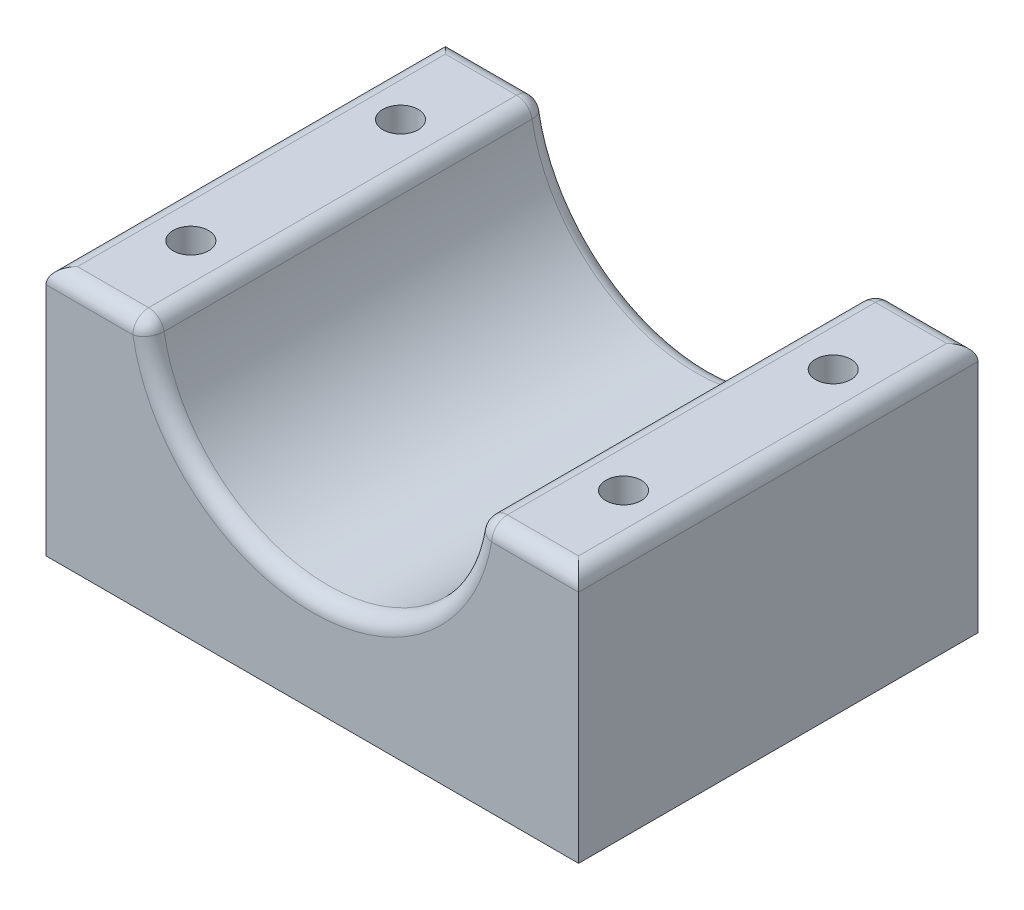
ISO-10303-21;
HEADER;
FILE_DESCRIPTION(('STEP AP214'),'2;1');
FILE_NAME('part.step','',(''),(''),'','','');
FILE_SCHEMA(('AUTOMOTIVE_DESIGN { 1 0 10303 214 1 1 1 1 }'));
ENDSEC;
DATA;
#1=APPLICATION_CONTEXT('core data for automotive mechanical design processes');
#2=APPLICATION_PROTOCOL_DEFINITION('international standard','automotive_design',2000,#1);
#3=PRODUCT_CONTEXT('',#1,'mechanical');
#4=PRODUCT('Part','Part','',(#3));
#5=PRODUCT_RELATED_PRODUCT_CATEGORY('part','',(#4));
#6=PRODUCT_DEFINITION_FORMATION('','',#4);
#7=PRODUCT_DEFINITION_CONTEXT('part definition',#1,'design');
#8=PRODUCT_DEFINITION('design','',#6,#7);
#9=PRODUCT_DEFINITION_SHAPE('','',#8);
#10=(LENGTH_UNIT() NAMED_UNIT(*) SI_UNIT(.MILLI.,.METRE.));
#11=(NAMED_UNIT(*) PLANE_ANGLE_UNIT() SI_UNIT($,.RADIAN.));
#12=(NAMED_UNIT(*) SI_UNIT($,.STERADIAN.) SOLID_ANGLE_UNIT());
#13=UNCERTAINTY_MEASURE_WITH_UNIT(LENGTH_MEASURE(1.E-05),#10,'distance_accuracy_value','');
#14=(GEOMETRIC_REPRESENTATION_CONTEXT(3) GLOBAL_UNCERTAINTY_ASSIGNED_CONTEXT((#13)) GLOBAL_UNIT_ASSIGNED_CONTEXT((#10,
#11,#12)) REPRESENTATION_CONTEXT('',''));
#15=CARTESIAN_POINT('',(0.,0.,0.));
#16=DIRECTION('',(0.,0.,1.));
#17=DIRECTION('',(1.,0.,0.));
#18=AXIS2_PLACEMENT_3D('',#15,#16,#17);
#19=CARTESIAN_POINT('',(-50.8,23.9,76.2));
#20=DIRECTION('',(0.,-1.,0.));
#21=DIRECTION('',(0.,0.,-1.));
#22=AXIS2_PLACEMENT_3D('',#19,#20,#21);
#23=PLANE('',#22);
#24=CARTESIAN_POINT('',(41.28,23.9,18.1));
#25=DIRECTION('',(0.,-1.,0.));
#26=DIRECTION('',(0.,0.,-1.));
#27=AXIS2_PLACEMENT_3D('',#24,#25,#26);
#28=CIRCLE('',#27,3.37819999999999);
#29=CARTESIAN_POINT('',(41.28,23.9,14.7218));
#30=VERTEX_POINT('',#29);
#31=EDGE_CURVE('E394',#30,#30,#28,.T.);
#32=ORIENTED_EDGE('',*,*,#31,.T.);
#33=EDGE_LOOP('',(#32));
#34=FACE_BOUND('',#33,.T.);
#35=CARTESIAN_POINT('',(41.28,23.9,58.1));
#36=DIRECTION('',(0.,-1.,0.));
#37=DIRECTION('',(0.,0.,-1.));
#38=AXIS2_PLACEMENT_3D('',#35,#36,#37);
#39=CIRCLE('',#38,3.37819999999999);
#40=CARTESIAN_POINT('',(41.28,23.9,54.7218));
#41=VERTEX_POINT('',#40);
#42=EDGE_CURVE('E374',#41,#41,#39,.T.);
#43=ORIENTED_EDGE('',*,*,#42,.T.);
#44=EDGE_LOOP('',(#43));
#45=FACE_BOUND('',#44,.T.);
#46=DIRECTION('',(-1.,0.,0.));
#47=VECTOR('',#46,1.);
#48=CARTESIAN_POINT('',(-50.8,23.9,73.2));
#49=LINE('',#48,#47);
#50=CARTESIAN_POINT('',(34.2280951850961,23.9,73.2));
#51=VERTEX_POINT('',#50);
#52=CARTESIAN_POINT('',(47.8,23.9,73.2));
#53=VERTEX_POINT('',#52);
#54=EDGE_CURVE('E175',#51,#53,#49,.F.);
#55=ORIENTED_EDGE('',*,*,#54,.T.);
#56=DIRECTION('',(0.,0.,-1.));
#57=VECTOR('',#56,1.);
#58=CARTESIAN_POINT('',(47.8,23.9,76.2));
#59=LINE('',#58,#57);
#60=CARTESIAN_POINT('',(47.8,23.9,3.));
#61=VERTEX_POINT('',#60);
#62=EDGE_CURVE('E178',#53,#61,#59,.T.);
#63=ORIENTED_EDGE('',*,*,#62,.T.);
#64=DIRECTION('',(-1.,0.,0.));
#65=VECTOR('',#64,1.);
#66=CARTESIAN_POINT('',(31.6079499493403,23.9,3.));
#67=LINE('',#66,#65);
#68=CARTESIAN_POINT('',(34.2280951850961,23.9,3.));
#69=VERTEX_POINT('',#68);
#70=EDGE_CURVE('E172',#61,#69,#67,.T.);
#71=ORIENTED_EDGE('',*,*,#70,.T.);
#72=DIRECTION('',(0.,0.,1.));
#73=VECTOR('',#72,1.);
#74=CARTESIAN_POINT('',(34.2280951850961,23.9,76.2));
#75=LINE('',#74,#73);
#76=EDGE_CURVE('E149',#69,#51,#75,.T.);
#77=ORIENTED_EDGE('',*,*,#76,.T.);
#78=EDGE_LOOP('',(#55,#63,#71,#77));
#79=FACE_BOUND('',#78,.T.);
#80=ADVANCED_FACE('F39',(#34,#45,#79),#23,.F.);
#81=CARTESIAN_POINT('',(50.8,-23.9,76.2));
#82=DIRECTION('',(-1.,0.,0.));
#83=DIRECTION('',(0.,0.,1.));
#84=AXIS2_PLACEMENT_3D('',#81,#82,#83);
#85=PLANE('',#84);
#86=DIRECTION('',(0.,1.,0.));
#87=VECTOR('',#86,1.);
#88=CARTESIAN_POINT('',(50.8,-23.9,0.));
#89=LINE('',#88,#87);
#90=CARTESIAN_POINT('',(50.8,-23.9,0.));
#91=VERTEX_POINT('',#90);
#92=CARTESIAN_POINT('',(50.8,20.9,0.));
#93=VERTEX_POINT('',#92);
#94=EDGE_CURVE('E161',#91,#93,#89,.T.);
#95=ORIENTED_EDGE('',*,*,#94,.T.);
#96=DIRECTION('',(0.,0.,-1.));
#97=VECTOR('',#96,1.);
#98=CARTESIAN_POINT('',(50.8,20.9,76.2));
#99=LINE('',#98,#97);
#100=CARTESIAN_POINT('',(50.8,20.9,76.2));
#101=VERTEX_POINT('',#100);
#102=EDGE_CURVE('E182',#93,#101,#99,.F.);
#103=ORIENTED_EDGE('',*,*,#102,.T.);
#104=DIRECTION('',(0.,1.,0.));
#105=VECTOR('',#104,1.);
#106=CARTESIAN_POINT('',(50.8,-23.9,76.2));
#107=LINE('',#106,#105);
#108=CARTESIAN_POINT('',(50.8,-23.9,76.2));
#109=VERTEX_POINT('',#108);
#110=EDGE_CURVE('E139',#109,#101,#107,.T.);
#111=ORIENTED_EDGE('',*,*,#110,.F.);
#112=DIRECTION('',(0.,0.,-1.));
#113=VECTOR('',#112,1.);
#114=CARTESIAN_POINT('',(50.8,-23.9,76.2));
#115=LINE('',#114,#113);
#116=EDGE_CURVE('E150',#109,#91,#115,.T.);
#117=ORIENTED_EDGE('',*,*,#116,.T.);
#118=EDGE_LOOP('',(#95,#103,#111,#117));
#119=FACE_BOUND('',#118,.T.);
#120=ADVANCED_FACE('F331',(#119),#85,.F.);
#121=CARTESIAN_POINT('',(-41.27,23.9,18.1));
#122=DIRECTION('',(0.,-1.,0.));
#123=DIRECTION('',(0.,0.,-1.));
#124=AXIS2_PLACEMENT_3D('',#121,#122,#123);
#125=CIRCLE('',#124,3.37819999999999);
#126=CARTESIAN_POINT('',(-41.27,23.9,14.7218));
#127=VERTEX_POINT('',#126);
#128=EDGE_CURVE('E354',#127,#127,#125,.T.);
#129=ORIENTED_EDGE('',*,*,#128,.T.);
#130=EDGE_LOOP('',(#129));
#131=FACE_BOUND('',#130,.T.);
#132=CARTESIAN_POINT('',(-41.27,23.9,58.1));
#133=DIRECTION('',(0.,-1.,0.));
#134=DIRECTION('',(0.,0.,-1.));
#135=AXIS2_PLACEMENT_3D('',#132,#133,#134);
#136=CIRCLE('',#135,3.37819999999999);
#137=CARTESIAN_POINT('',(-41.27,23.9,54.7218));
#138=VERTEX_POINT('',#137);
#139=EDGE_CURVE('E230',#138,#138,#136,.T.);
#140=ORIENTED_EDGE('',*,*,#139,.T.);
#141=EDGE_LOOP('',(#140));
#142=FACE_BOUND('',#141,.T.);
#143=DIRECTION('',(-1.,0.,0.));
#144=VECTOR('',#143,1.);
#145=CARTESIAN_POINT('',(-50.8,23.9,3.));
#146=LINE('',#145,#144);
#147=CARTESIAN_POINT('',(-34.2280951850961,23.9,3.));
#148=VERTEX_POINT('',#147);
#149=CARTESIAN_POINT('',(-47.8,23.9,3.));
#150=VERTEX_POINT('',#149);
#151=EDGE_CURVE('E49',#148,#150,#146,.T.);
#152=ORIENTED_EDGE('',*,*,#151,.T.);
#153=DIRECTION('',(0.,0.,-1.));
#154=VECTOR('',#153,1.);
#155=CARTESIAN_POINT('',(-47.8,23.9,76.2));
#156=LINE('',#155,#154);
#157=CARTESIAN_POINT('',(-47.8,23.9,73.2));
#158=VERTEX_POINT('',#157);
#159=EDGE_CURVE('E11',#150,#158,#156,.F.);
#160=ORIENTED_EDGE('',*,*,#159,.T.);
#161=DIRECTION('',(-1.,0.,0.));
#162=VECTOR('',#161,1.);
#163=CARTESIAN_POINT('',(-50.8,23.9,73.2));
#164=LINE('',#163,#162);
#165=CARTESIAN_POINT('',(-34.2280951850961,23.9,73.2));
#166=VERTEX_POINT('',#165);
#167=EDGE_CURVE('E219',#158,#166,#164,.F.);
#168=ORIENTED_EDGE('',*,*,#167,.T.);
#169=DIRECTION('',(0.,0.,1.));
#170=VECTOR('',#169,1.);
#171=CARTESIAN_POINT('',(-34.2280951850961,23.9,76.2));
#172=LINE('',#171,#170);
#173=EDGE_CURVE('E60',#166,#148,#172,.F.);
#174=ORIENTED_EDGE('',*,*,#173,.T.);
#175=EDGE_LOOP('',(#152,#160,#168,#174));
#176=FACE_BOUND('',#175,.T.);
#177=ADVANCED_FACE('F292',(#131,#142,#176),#23,.F.);
#178=CARTESIAN_POINT('',(-50.8,-23.9,76.2));
#179=DIRECTION('',(1.,0.,0.));
#180=DIRECTION('',(0.,0.,-1.));
#181=AXIS2_PLACEMENT_3D('',#178,#179,#180);
#182=PLANE('',#181);
#183=DIRECTION('',(0.,-1.,0.));
#184=VECTOR('',#183,1.);
#185=CARTESIAN_POINT('',(-50.8,-23.9,76.2));
#186=LINE('',#185,#184);
#187=CARTESIAN_POINT('',(-50.8,20.9,76.2));
#188=VERTEX_POINT('',#187);
#189=CARTESIAN_POINT('',(-50.8,-23.9,76.2));
#190=VERTEX_POINT('',#189);
#191=EDGE_CURVE('E127',#188,#190,#186,.T.);
#192=ORIENTED_EDGE('',*,*,#191,.F.);
#193=DIRECTION('',(0.,0.,-1.));
#194=VECTOR('',#193,1.);
#195=CARTESIAN_POINT('',(-50.8,20.9,76.2));
#196=LINE('',#195,#194);
#197=CARTESIAN_POINT('',(-50.8,20.9,0.));
#198=VERTEX_POINT('',#197);
#199=EDGE_CURVE('E216',#188,#198,#196,.T.);
#200=ORIENTED_EDGE('',*,*,#199,.T.);
#201=DIRECTION('',(0.,-1.,0.));
#202=VECTOR('',#201,1.);
#203=CARTESIAN_POINT('',(-50.8,-23.9,0.));
#204=LINE('',#203,#202);
#205=CARTESIAN_POINT('',(-50.8,-23.9,0.));
#206=VERTEX_POINT('',#205);
#207=EDGE_CURVE('E145',#198,#206,#204,.T.);
#208=ORIENTED_EDGE('',*,*,#207,.T.);
#209=DIRECTION('',(0.,0.,-1.));
#210=VECTOR('',#209,1.);
#211=CARTESIAN_POINT('',(-50.8,-23.9,76.2));
#212=LINE('',#211,#210);
#213=EDGE_CURVE('E142',#190,#206,#212,.T.);
#214=ORIENTED_EDGE('',*,*,#213,.F.);
#215=EDGE_LOOP('',(#192,#200,#208,#214));
#216=FACE_BOUND('',#215,.T.);
#217=ADVANCED_FACE('F143',(#216),#182,.F.);
#218=CARTESIAN_POINT('',(-50.8,-23.9,76.2));
#219=DIRECTION('',(0.,1.,0.));
#220=DIRECTION('',(0.,0.,1.));
#221=AXIS2_PLACEMENT_3D('',#218,#219,#220);
#222=PLANE('',#221);
#223=CARTESIAN_POINT('',(41.28,-23.9,18.1));
#224=DIRECTION('',(0.,-1.,0.));
#225=DIRECTION('',(0.,0.,-1.));
#226=AXIS2_PLACEMENT_3D('',#223,#224,#225);
#227=CIRCLE('',#226,7.77875);
#228=CARTESIAN_POINT('',(41.28,-23.9,10.32125));
#229=VERTEX_POINT('',#228);
#230=EDGE_CURVE('E410',#229,#229,#227,.T.);
#231=ORIENTED_EDGE('',*,*,#230,.F.);
#232=EDGE_LOOP('',(#231));
#233=FACE_BOUND('',#232,.T.);
#234=CARTESIAN_POINT('',(41.28,-23.9,58.1));
#235=DIRECTION('',(0.,-1.,0.));
#236=DIRECTION('',(0.,0.,-1.));
#237=AXIS2_PLACEMENT_3D('',#234,#235,#236);
#238=CIRCLE('',#237,7.77875);
#239=CARTESIAN_POINT('',(41.28,-23.9,50.32125));
#240=VERTEX_POINT('',#239);
#241=EDGE_CURVE('E390',#240,#240,#238,.T.);
#242=ORIENTED_EDGE('',*,*,#241,.F.);
#243=EDGE_LOOP('',(#242));
#244=FACE_BOUND('',#243,.T.);
#245=CARTESIAN_POINT('',(-41.27,-23.9,18.1));
#246=DIRECTION('',(0.,-1.,0.));
#247=DIRECTION('',(0.,0.,-1.));
#248=AXIS2_PLACEMENT_3D('',#245,#246,#247);
#249=CIRCLE('',#248,7.77875);
#250=CARTESIAN_POINT('',(-41.27,-23.9,10.32125));
#251=VERTEX_POINT('',#250);
#252=EDGE_CURVE('E370',#251,#251,#249,.T.);
#253=ORIENTED_EDGE('',*,*,#252,.F.);
#254=EDGE_LOOP('',(#253));
#255=FACE_BOUND('',#254,.T.);
#256=CARTESIAN_POINT('',(-41.27,-23.9,58.1));
#257=DIRECTION('',(0.,-1.,0.));
#258=DIRECTION('',(0.,0.,-1.));
#259=AXIS2_PLACEMENT_3D('',#256,#257,#258);
#260=CIRCLE('',#259,7.77875);
#261=CARTESIAN_POINT('',(-41.27,-23.9,50.32125));
#262=VERTEX_POINT('',#261);
#263=EDGE_CURVE('E350',#262,#262,#260,.T.);
#264=ORIENTED_EDGE('',*,*,#263,.F.);
#265=EDGE_LOOP('',(#264));
#266=FACE_BOUND('',#265,.T.);
#267=DIRECTION('',(1.,0.,0.));
#268=VECTOR('',#267,1.);
#269=CARTESIAN_POINT('',(-50.8,-23.9,0.));
#270=LINE('',#269,#268);
#271=EDGE_CURVE('E167',#206,#91,#270,.T.);
#272=ORIENTED_EDGE('',*,*,#271,.T.);
#273=ORIENTED_EDGE('',*,*,#116,.F.);
#274=DIRECTION('',(1.,0.,0.));
#275=VECTOR('',#274,1.);
#276=CARTESIAN_POINT('',(-50.8,-23.9,76.2));
#277=LINE('',#276,#275);
#278=EDGE_CURVE('E132',#190,#109,#277,.T.);
#279=ORIENTED_EDGE('',*,*,#278,.F.);
#280=ORIENTED_EDGE('',*,*,#213,.T.);
#281=EDGE_LOOP('',(#272,#273,#279,#280));
#282=FACE_BOUND('',#281,.T.);
#283=ADVANCED_FACE('F152',(#233,#244,#255,#266,#282),#222,.F.);
#284=CARTESIAN_POINT('',(0.,0.,76.2));
#285=DIRECTION('',(0.,0.,-1.));
#286=DIRECTION('',(-1.,0.,0.));
#287=AXIS2_PLACEMENT_3D('',#284,#285,#286);
#288=PLANE('',#287);
#289=ORIENTED_EDGE('',*,*,#110,.T.);
#290=DIRECTION('',(-1.,0.,0.));
#291=VECTOR('',#290,1.);
#292=CARTESIAN_POINT('',(0.,20.9,76.2));
#293=LINE('',#292,#291);
#294=CARTESIAN_POINT('',(34.2280951850961,20.9,76.2));
#295=VERTEX_POINT('',#294);
#296=EDGE_CURVE('E191',#101,#295,#293,.T.);
#297=ORIENTED_EDGE('',*,*,#296,.T.);
#298=CARTESIAN_POINT('',(0.,26.9,76.2));
#299=DIRECTION('',(0.,0.,-1.));
#300=DIRECTION('',(-1.,0.,0.));
#301=AXIS2_PLACEMENT_3D('',#298,#299,#300);
#302=CIRCLE('',#301,34.75);
#303=CARTESIAN_POINT('',(-34.2280951850961,20.9,76.2));
#304=VERTEX_POINT('',#303);
#305=EDGE_CURVE('E188',#295,#304,#302,.T.);
#306=ORIENTED_EDGE('',*,*,#305,.T.);
#307=DIRECTION('',(-1.,0.,0.));
#308=VECTOR('',#307,1.);
#309=CARTESIAN_POINT('',(0.,20.9,76.2));
#310=LINE('',#309,#308);
#311=EDGE_CURVE('E135',#304,#188,#310,.T.);
#312=ORIENTED_EDGE('',*,*,#311,.T.);
#313=ORIENTED_EDGE('',*,*,#191,.T.);
#314=ORIENTED_EDGE('',*,*,#278,.T.);
#315=EDGE_LOOP('',(#289,#297,#306,#312,#313,#314));
#316=FACE_BOUND('',#315,.T.);
#317=ADVANCED_FACE('F130',(#316),#288,.F.);
#318=CARTESIAN_POINT('',(0.,0.,0.));
#319=DIRECTION('',(0.,0.,-1.));
#320=DIRECTION('',(-1.,0.,0.));
#321=AXIS2_PLACEMENT_3D('',#318,#319,#320);
#322=PLANE('',#321);
#323=CARTESIAN_POINT('',(0.,26.9,0.));
#324=DIRECTION('',(0.,0.,-1.));
#325=DIRECTION('',(-1.,0.,0.));
#326=AXIS2_PLACEMENT_3D('',#323,#324,#325);
#327=CIRCLE('',#326,34.75);
#328=CARTESIAN_POINT('',(-34.2280951850961,20.9,0.));
#329=VERTEX_POINT('',#328);
#330=CARTESIAN_POINT('',(34.2280951850961,20.9,0.));
#331=VERTEX_POINT('',#330);
#332=EDGE_CURVE('E197',#329,#331,#327,.F.);
#333=ORIENTED_EDGE('',*,*,#332,.T.);
#334=DIRECTION('',(-1.,0.,0.));
#335=VECTOR('',#334,1.);
#336=CARTESIAN_POINT('',(50.8,20.9,0.));
#337=LINE('',#336,#335);
#338=EDGE_CURVE('E200',#331,#93,#337,.F.);
#339=ORIENTED_EDGE('',*,*,#338,.T.);
#340=ORIENTED_EDGE('',*,*,#94,.F.);
#341=ORIENTED_EDGE('',*,*,#271,.F.);
#342=ORIENTED_EDGE('',*,*,#207,.F.);
#343=DIRECTION('',(-1.,0.,0.));
#344=VECTOR('',#343,1.);
#345=CARTESIAN_POINT('',(-31.6079499493403,20.9,0.));
#346=LINE('',#345,#344);
#347=EDGE_CURVE('E194',#198,#329,#346,.F.);
#348=ORIENTED_EDGE('',*,*,#347,.T.);
#349=EDGE_LOOP('',(#333,#339,#340,#341,#342,#348));
#350=FACE_BOUND('',#349,.T.);
#351=ADVANCED_FACE('F328',(#350),#322,.T.);
#352=CARTESIAN_POINT('',(0.,26.9,0.));
#353=DIRECTION('',(0.,0.,1.));
#354=DIRECTION('',(1.,0.,0.));
#355=AXIS2_PLACEMENT_3D('',#352,#353,#354);
#356=CYLINDRICAL_SURFACE('',#355,31.75);
#357=CARTESIAN_POINT('',(0.,26.9,73.2));
#358=DIRECTION('',(0.,0.,-1.));
#359=DIRECTION('',(-1.,0.,0.));
#360=AXIS2_PLACEMENT_3D('',#357,#358,#359);
#361=CIRCLE('',#360,31.75);
#362=CARTESIAN_POINT('',(-31.2731517158792,21.4179856115108,73.2));
#363=VERTEX_POINT('',#362);
#364=CARTESIAN_POINT('',(31.2731517158792,21.4179856115108,73.2));
#365=VERTEX_POINT('',#364);
#366=EDGE_CURVE('E209',#363,#365,#361,.F.);
#367=ORIENTED_EDGE('',*,*,#366,.T.);
#368=DIRECTION('',(0.,0.,1.));
#369=VECTOR('',#368,1.);
#370=CARTESIAN_POINT('',(31.2731517158792,21.4179856115108,0.));
#371=LINE('',#370,#369);
#372=CARTESIAN_POINT('',(31.2731517158792,21.4179856115108,3.));
#373=VERTEX_POINT('',#372);
#374=EDGE_CURVE('E212',#365,#373,#371,.F.);
#375=ORIENTED_EDGE('',*,*,#374,.T.);
#376=CARTESIAN_POINT('',(0.,26.9,3.));
#377=DIRECTION('',(0.,0.,-1.));
#378=DIRECTION('',(-1.,0.,0.));
#379=AXIS2_PLACEMENT_3D('',#376,#377,#378);
#380=CIRCLE('',#379,31.75);
#381=CARTESIAN_POINT('',(-31.2731517158792,21.4179856115108,3.));
#382=VERTEX_POINT('',#381);
#383=EDGE_CURVE('E206',#373,#382,#380,.T.);
#384=ORIENTED_EDGE('',*,*,#383,.T.);
#385=DIRECTION('',(0.,0.,1.));
#386=VECTOR('',#385,1.);
#387=CARTESIAN_POINT('',(-31.2731517158792,21.4179856115108,0.));
#388=LINE('',#387,#386);
#389=EDGE_CURVE('E203',#382,#363,#388,.T.);
#390=ORIENTED_EDGE('',*,*,#389,.T.);
#391=EDGE_LOOP('',(#367,#375,#384,#390));
#392=FACE_BOUND('',#391,.T.);
#393=ADVANCED_FACE('F308',(#392),#356,.F.);
#394=CARTESIAN_POINT('',(-47.8,20.9,76.2));
#395=DIRECTION('',(0.,0.,-1.));
#396=DIRECTION('',(-1.,0.,0.));
#397=AXIS2_PLACEMENT_3D('',#394,#395,#396);
#398=CYLINDRICAL_SURFACE('',#397,3.);
#399=CARTESIAN_POINT('',(-47.8,20.9,3.));
#400=DIRECTION('',(0.707106781186547,0.,-0.707106781186547));
#401=DIRECTION('',(0.707106781186547,0.,0.707106781186547));
#402=AXIS2_PLACEMENT_3D('',#399,#400,#401);
#403=ELLIPSE('',#402,4.24264068711928,3.);
#404=EDGE_CURVE('E279',#198,#150,#403,.T.);
#405=ORIENTED_EDGE('',*,*,#404,.F.);
#406=ORIENTED_EDGE('',*,*,#199,.F.);
#407=CARTESIAN_POINT('',(-47.8,20.9,73.2));
#408=DIRECTION('',(-0.707106781186547,0.,-0.707106781186547));
#409=DIRECTION('',(-0.707106781186547,0.,0.707106781186547));
#410=AXIS2_PLACEMENT_3D('',#407,#408,#409);
#411=ELLIPSE('',#410,4.24264068711928,3.);
#412=EDGE_CURVE('E43',#158,#188,#411,.F.);
#413=ORIENTED_EDGE('',*,*,#412,.F.);
#414=ORIENTED_EDGE('',*,*,#159,.F.);
#415=EDGE_LOOP('',(#405,#406,#413,#414));
#416=FACE_BOUND('',#415,.T.);
#417=ADVANCED_FACE('F41',(#416),#398,.T.);
#418=CARTESIAN_POINT('',(0.,20.9,73.2));
#419=DIRECTION('',(-1.,0.,0.));
#420=DIRECTION('',(0.,0.,1.));
#421=AXIS2_PLACEMENT_3D('',#418,#419,#420);
#422=CYLINDRICAL_SURFACE('',#421,3.);
#423=ORIENTED_EDGE('',*,*,#412,.T.);
#424=ORIENTED_EDGE('',*,*,#311,.F.);
#425=CARTESIAN_POINT('',(-34.2280951850961,20.9,73.2));
#426=DIRECTION('',(1.,0.,0.));
#427=DIRECTION('',(0.,0.,-1.));
#428=AXIS2_PLACEMENT_3D('',#425,#426,#427);
#429=CIRCLE('',#428,3.);
#430=EDGE_CURVE('E276',#166,#304,#429,.T.);
#431=ORIENTED_EDGE('',*,*,#430,.F.);
#432=ORIENTED_EDGE('',*,*,#167,.F.);
#433=EDGE_LOOP('',(#423,#424,#431,#432));
#434=FACE_BOUND('',#433,.T.);
#435=ADVANCED_FACE('F289',(#434),#422,.T.);
#436=CARTESIAN_POINT('',(-34.2280951850961,20.9,0.));
#437=DIRECTION('',(0.,0.,1.));
#438=DIRECTION('',(1.,0.,0.));
#439=AXIS2_PLACEMENT_3D('',#436,#437,#438);
#440=CYLINDRICAL_SURFACE('',#439,3.);
#441=CARTESIAN_POINT('',(-34.2280951850961,20.9,3.));
#442=DIRECTION('',(0.,0.,-1.));
#443=DIRECTION('',(-1.,0.,0.));
#444=AXIS2_PLACEMENT_3D('',#441,#442,#443);
#445=CIRCLE('',#444,3.);
#446=EDGE_CURVE('E268',#148,#382,#445,.T.);
#447=ORIENTED_EDGE('',*,*,#446,.F.);
#448=ORIENTED_EDGE('',*,*,#173,.F.);
#449=CARTESIAN_POINT('',(-34.2280951850961,20.9,73.2));
#450=DIRECTION('',(0.,0.,1.));
#451=DIRECTION('',(1.,0.,0.));
#452=AXIS2_PLACEMENT_3D('',#449,#450,#451);
#453=CIRCLE('',#452,3.);
#454=EDGE_CURVE('E272',#363,#166,#453,.T.);
#455=ORIENTED_EDGE('',*,*,#454,.F.);
#456=ORIENTED_EDGE('',*,*,#389,.F.);
#457=EDGE_LOOP('',(#447,#448,#455,#456));
#458=FACE_BOUND('',#457,.T.);
#459=ADVANCED_FACE('F296',(#458),#440,.T.);
#460=CARTESIAN_POINT('',(-50.8,20.9,3.));
#461=DIRECTION('',(1.,0.,0.));
#462=DIRECTION('',(0.,0.,-1.));
#463=AXIS2_PLACEMENT_3D('',#460,#461,#462);
#464=CYLINDRICAL_SURFACE('',#463,3.);
#465=ORIENTED_EDGE('',*,*,#404,.T.);
#466=ORIENTED_EDGE('',*,*,#151,.F.);
#467=CARTESIAN_POINT('',(-34.2280951850961,20.9,3.));
#468=DIRECTION('',(1.,0.,0.));
#469=DIRECTION('',(0.,1.,0.));
#470=AXIS2_PLACEMENT_3D('',#467,#468,#469);
#471=CIRCLE('',#470,3.);
#472=EDGE_CURVE('E264',#329,#148,#471,.T.);
#473=ORIENTED_EDGE('',*,*,#472,.F.);
#474=ORIENTED_EDGE('',*,*,#347,.F.);
#475=EDGE_LOOP('',(#465,#466,#473,#474));
#476=FACE_BOUND('',#475,.T.);
#477=ADVANCED_FACE('F326',(#476),#464,.T.);
#478=CARTESIAN_POINT('',(-34.2280951850961,20.9,73.2));
#479=DIRECTION('',(0.,0.,1.));
#480=DIRECTION('',(1.,0.,0.));
#481=AXIS2_PLACEMENT_3D('',#478,#479,#480);
#482=SPHERICAL_SURFACE('',#481,3.);
#483=ORIENTED_EDGE('',*,*,#454,.T.);
#484=ORIENTED_EDGE('',*,*,#430,.T.);
#485=CARTESIAN_POINT('',(-34.2280951850961,20.9,73.2));
#486=DIRECTION('',(-0.172661870503597,0.984981156405644,0.));
#487=DIRECTION('',(-0.984981156405644,-0.172661870503597,0.));
#488=AXIS2_PLACEMENT_3D('',#485,#486,#487);
#489=CIRCLE('',#488,3.);
#490=EDGE_CURVE('E260',#363,#304,#489,.F.);
#491=ORIENTED_EDGE('',*,*,#490,.F.);
#492=EDGE_LOOP('',(#483,#484,#491));
#493=FACE_BOUND('',#492,.T.);
#494=ADVANCED_FACE('F300',(#493),#482,.T.);
#495=CARTESIAN_POINT('',(-34.2280951850961,20.9,3.));
#496=DIRECTION('',(0.,0.,1.));
#497=DIRECTION('',(1.,0.,0.));
#498=AXIS2_PLACEMENT_3D('',#495,#496,#497);
#499=SPHERICAL_SURFACE('',#498,3.);
#500=ORIENTED_EDGE('',*,*,#472,.T.);
#501=ORIENTED_EDGE('',*,*,#446,.T.);
#502=CARTESIAN_POINT('',(-34.2280951850961,20.9,3.));
#503=DIRECTION('',(-0.172661870503597,0.984981156405644,0.));
#504=DIRECTION('',(-0.984981156405644,-0.172661870503597,0.));
#505=AXIS2_PLACEMENT_3D('',#502,#503,#504);
#506=CIRCLE('',#505,3.);
#507=EDGE_CURVE('E256',#329,#382,#506,.F.);
#508=ORIENTED_EDGE('',*,*,#507,.F.);
#509=EDGE_LOOP('',(#500,#501,#508));
#510=FACE_BOUND('',#509,.T.);
#511=ADVANCED_FACE('F324',(#510),#499,.T.);
#512=CARTESIAN_POINT('',(0.,26.9,73.2));
#513=DIRECTION('',(0.,0.,-1.));
#514=DIRECTION('',(-1.,0.,0.));
#515=AXIS2_PLACEMENT_3D('',#512,#513,#514);
#516=TOROIDAL_SURFACE('',#515,34.75,3.);
#517=ORIENTED_EDGE('',*,*,#490,.T.);
#518=ORIENTED_EDGE('',*,*,#305,.F.);
#519=CARTESIAN_POINT('',(34.2280951850961,20.9,73.2));
#520=DIRECTION('',(0.172661870503597,0.984981156405644,0.));
#521=DIRECTION('',(-0.984981156405644,0.172661870503597,0.));
#522=AXIS2_PLACEMENT_3D('',#519,#520,#521);
#523=CIRCLE('',#522,3.);
#524=EDGE_CURVE('E252',#365,#295,#523,.T.);
#525=ORIENTED_EDGE('',*,*,#524,.F.);
#526=ORIENTED_EDGE('',*,*,#366,.F.);
#527=EDGE_LOOP('',(#517,#518,#525,#526));
#528=FACE_BOUND('',#527,.T.);
#529=ADVANCED_FACE('F305',(#528),#516,.T.);
#530=CARTESIAN_POINT('',(34.2280951850961,20.9,0.));
#531=DIRECTION('',(0.,0.,1.));
#532=DIRECTION('',(1.,0.,0.));
#533=AXIS2_PLACEMENT_3D('',#530,#531,#532);
#534=CYLINDRICAL_SURFACE('',#533,3.);
#535=CARTESIAN_POINT('',(34.2280951850961,20.9,3.));
#536=DIRECTION('',(0.,0.,-1.));
#537=DIRECTION('',(0.,1.,0.));
#538=AXIS2_PLACEMENT_3D('',#535,#536,#537);
#539=CIRCLE('',#538,3.);
#540=EDGE_CURVE('E244',#373,#69,#539,.T.);
#541=ORIENTED_EDGE('',*,*,#540,.F.);
#542=ORIENTED_EDGE('',*,*,#374,.F.);
#543=CARTESIAN_POINT('',(34.2280951850961,20.9,73.2));
#544=DIRECTION('',(0.,0.,1.));
#545=DIRECTION('',(1.,0.,0.));
#546=AXIS2_PLACEMENT_3D('',#543,#544,#545);
#547=CIRCLE('',#546,3.);
#548=EDGE_CURVE('E248',#51,#365,#547,.T.);
#549=ORIENTED_EDGE('',*,*,#548,.F.);
#550=ORIENTED_EDGE('',*,*,#76,.F.);
#551=EDGE_LOOP('',(#541,#542,#549,#550));
#552=FACE_BOUND('',#551,.T.);
#553=ADVANCED_FACE('F312',(#552),#534,.T.);
#554=CARTESIAN_POINT('',(0.,26.9,3.));
#555=DIRECTION('',(0.,0.,-1.));
#556=DIRECTION('',(-1.,0.,0.));
#557=AXIS2_PLACEMENT_3D('',#554,#555,#556);
#558=TOROIDAL_SURFACE('',#557,34.75,3.);
#559=ORIENTED_EDGE('',*,*,#507,.T.);
#560=ORIENTED_EDGE('',*,*,#383,.F.);
#561=CARTESIAN_POINT('',(34.2280951850961,20.9,3.));
#562=DIRECTION('',(0.172661870503597,0.984981156405644,0.));
#563=DIRECTION('',(-0.984981156405644,0.172661870503597,0.));
#564=AXIS2_PLACEMENT_3D('',#561,#562,#563);
#565=CIRCLE('',#564,3.);
#566=EDGE_CURVE('E241',#331,#373,#565,.T.);
#567=ORIENTED_EDGE('',*,*,#566,.F.);
#568=ORIENTED_EDGE('',*,*,#332,.F.);
#569=EDGE_LOOP('',(#559,#560,#567,#568));
#570=FACE_BOUND('',#569,.T.);
#571=ADVANCED_FACE('F320',(#570),#558,.T.);
#572=CARTESIAN_POINT('',(34.2280951850961,20.9,73.2));
#573=DIRECTION('',(0.,0.,1.));
#574=DIRECTION('',(1.,0.,0.));
#575=AXIS2_PLACEMENT_3D('',#572,#573,#574);
#576=SPHERICAL_SURFACE('',#575,3.);
#577=ORIENTED_EDGE('',*,*,#548,.T.);
#578=ORIENTED_EDGE('',*,*,#524,.T.);
#579=CARTESIAN_POINT('',(34.2280951850961,20.9,73.2));
#580=DIRECTION('',(-1.,0.,0.));
#581=DIRECTION('',(0.,-1.,0.));
#582=AXIS2_PLACEMENT_3D('',#579,#580,#581);
#583=CIRCLE('',#582,3.);
#584=EDGE_CURVE('E237',#51,#295,#583,.F.);
#585=ORIENTED_EDGE('',*,*,#584,.F.);
#586=EDGE_LOOP('',(#577,#578,#585));
#587=FACE_BOUND('',#586,.T.);
#588=ADVANCED_FACE('F541',(#587),#576,.T.);
#589=CARTESIAN_POINT('',(34.2280951850961,20.9,3.));
#590=DIRECTION('',(0.,0.,1.));
#591=DIRECTION('',(1.,0.,0.));
#592=AXIS2_PLACEMENT_3D('',#589,#590,#591);
#593=SPHERICAL_SURFACE('',#592,3.);
#594=ORIENTED_EDGE('',*,*,#566,.T.);
#595=ORIENTED_EDGE('',*,*,#540,.T.);
#596=CARTESIAN_POINT('',(34.2280951850961,20.9,3.));
#597=DIRECTION('',(-1.,0.,0.));
#598=DIRECTION('',(0.,0.,1.));
#599=AXIS2_PLACEMENT_3D('',#596,#597,#598);
#600=CIRCLE('',#599,3.);
#601=EDGE_CURVE('E233',#331,#69,#600,.F.);
#602=ORIENTED_EDGE('',*,*,#601,.F.);
#603=EDGE_LOOP('',(#594,#595,#602));
#604=FACE_BOUND('',#603,.T.);
#605=ADVANCED_FACE('F548',(#604),#593,.T.);
#606=CARTESIAN_POINT('',(0.,20.9,73.2));
#607=DIRECTION('',(-1.,0.,0.));
#608=DIRECTION('',(0.,0.,1.));
#609=AXIS2_PLACEMENT_3D('',#606,#607,#608);
#610=CYLINDRICAL_SURFACE('',#609,3.);
#611=ORIENTED_EDGE('',*,*,#584,.T.);
#612=ORIENTED_EDGE('',*,*,#296,.F.);
#613=CARTESIAN_POINT('',(47.8,20.9,73.2));
#614=DIRECTION('',(-0.707106781186547,0.,0.707106781186547));
#615=DIRECTION('',(-0.707106781186547,0.,-0.707106781186547));
#616=AXIS2_PLACEMENT_3D('',#613,#614,#615);
#617=ELLIPSE('',#616,4.24264068711928,3.);
#618=EDGE_CURVE('E229',#53,#101,#617,.F.);
#619=ORIENTED_EDGE('',*,*,#618,.F.);
#620=ORIENTED_EDGE('',*,*,#54,.F.);
#621=EDGE_LOOP('',(#611,#612,#619,#620));
#622=FACE_BOUND('',#621,.T.);
#623=ADVANCED_FACE('F556',(#622),#610,.T.);
#624=CARTESIAN_POINT('',(-50.8,20.9,3.));
#625=DIRECTION('',(1.,0.,0.));
#626=DIRECTION('',(0.,0.,-1.));
#627=AXIS2_PLACEMENT_3D('',#624,#625,#626);
#628=CYLINDRICAL_SURFACE('',#627,3.);
#629=ORIENTED_EDGE('',*,*,#601,.T.);
#630=ORIENTED_EDGE('',*,*,#70,.F.);
#631=CARTESIAN_POINT('',(47.8,20.9,3.));
#632=DIRECTION('',(0.707106781186547,0.,0.707106781186547));
#633=DIRECTION('',(0.707106781186547,0.,-0.707106781186547));
#634=AXIS2_PLACEMENT_3D('',#631,#632,#633);
#635=ELLIPSE('',#634,4.24264068711928,3.);
#636=EDGE_CURVE('E226',#93,#61,#635,.T.);
#637=ORIENTED_EDGE('',*,*,#636,.F.);
#638=ORIENTED_EDGE('',*,*,#338,.F.);
#639=EDGE_LOOP('',(#629,#630,#637,#638));
#640=FACE_BOUND('',#639,.T.);
#641=ADVANCED_FACE('F563',(#640),#628,.T.);
#642=CARTESIAN_POINT('',(47.8,20.9,76.2));
#643=DIRECTION('',(0.,0.,-1.));
#644=DIRECTION('',(-1.,0.,0.));
#645=AXIS2_PLACEMENT_3D('',#642,#643,#644);
#646=CYLINDRICAL_SURFACE('',#645,3.);
#647=ORIENTED_EDGE('',*,*,#618,.T.);
#648=ORIENTED_EDGE('',*,*,#102,.F.);
#649=ORIENTED_EDGE('',*,*,#636,.T.);
#650=ORIENTED_EDGE('',*,*,#62,.F.);
#651=EDGE_LOOP('',(#647,#648,#649,#650));
#652=FACE_BOUND('',#651,.T.);
#653=ADVANCED_FACE('F464',(#652),#646,.T.);
#654=CARTESIAN_POINT('',(-41.27,-23.9,58.1));
#655=DIRECTION('',(0.,-1.,0.));
#656=DIRECTION('',(0.,0.,-1.));
#657=AXIS2_PLACEMENT_3D('',#654,#655,#656);
#658=CYLINDRICAL_SURFACE('',#657,3.37819999999999);
#659=ORIENTED_EDGE('',*,*,#139,.F.);
#660=EDGE_LOOP('',(#659));
#661=FACE_BOUND('',#660,.T.);
#662=CARTESIAN_POINT('',(-41.27,-19.709,58.1));
#663=DIRECTION('',(0.,-1.,0.));
#664=DIRECTION('',(0.,0.,-1.));
#665=AXIS2_PLACEMENT_3D('',#662,#663,#664);
#666=CIRCLE('',#665,3.3782);
#667=CARTESIAN_POINT('',(-41.27,-19.709,54.7218));
#668=VERTEX_POINT('',#667);
#669=EDGE_CURVE('E338',#668,#668,#666,.T.);
#670=ORIENTED_EDGE('',*,*,#669,.T.);
#671=EDGE_LOOP('',(#670));
#672=FACE_BOUND('',#671,.T.);
#673=ADVANCED_FACE('F461',(#661,#672),#658,.F.);
#674=CARTESIAN_POINT('',(-34.12625,-19.709,58.1));
#675=DIRECTION('',(0.,1.,0.));
#676=DIRECTION('',(0.,0.,1.));
#677=AXIS2_PLACEMENT_3D('',#674,#675,#676);
#678=PLANE('',#677);
#679=ORIENTED_EDGE('',*,*,#669,.F.);
#680=EDGE_LOOP('',(#679));
#681=FACE_BOUND('',#680,.T.);
#682=CARTESIAN_POINT('',(-41.27,-19.709,58.1));
#683=DIRECTION('',(0.,-1.,0.));
#684=DIRECTION('',(0.,0.,-1.));
#685=AXIS2_PLACEMENT_3D('',#682,#683,#684);
#686=CIRCLE('',#685,7.14375);
#687=CARTESIAN_POINT('',(-41.27,-19.709,50.95625));
#688=VERTEX_POINT('',#687);
#689=EDGE_CURVE('E342',#688,#688,#686,.T.);
#690=ORIENTED_EDGE('',*,*,#689,.T.);
#691=EDGE_LOOP('',(#690));
#692=FACE_BOUND('',#691,.T.);
#693=ADVANCED_FACE('F439',(#681,#692),#678,.F.);
#694=CARTESIAN_POINT('',(-41.27,-23.9,58.1));
#695=DIRECTION('',(0.,-1.,0.));
#696=DIRECTION('',(0.,0.,-1.));
#697=AXIS2_PLACEMENT_3D('',#694,#695,#696);
#698=CYLINDRICAL_SURFACE('',#697,7.14375);
#699=ORIENTED_EDGE('',*,*,#689,.F.);
#700=EDGE_LOOP('',(#699));
#701=FACE_BOUND('',#700,.T.);
#702=CARTESIAN_POINT('',(-41.27,-23.3671717342024,58.1));
#703=DIRECTION('',(0.,-1.,0.));
#704=DIRECTION('',(0.,0.,-1.));
#705=AXIS2_PLACEMENT_3D('',#702,#703,#704);
#706=CIRCLE('',#705,7.14375);
#707=CARTESIAN_POINT('',(-41.27,-23.3671717342024,50.95625));
#708=VERTEX_POINT('',#707);
#709=EDGE_CURVE('E346',#708,#708,#706,.T.);
#710=ORIENTED_EDGE('',*,*,#709,.T.);
#711=EDGE_LOOP('',(#710));
#712=FACE_BOUND('',#711,.T.);
#713=ADVANCED_FACE('F429',(#701,#712),#698,.F.);
#714=CARTESIAN_POINT('',(-41.27,-23.9,58.1));
#715=DIRECTION('',(0.,-1.,0.));
#716=DIRECTION('',(0.,0.,-1.));
#717=AXIS2_PLACEMENT_3D('',#714,#715,#716);
#718=CONICAL_SURFACE('',#717,7.77875,0.872664625997163);
#719=ORIENTED_EDGE('',*,*,#709,.F.);
#720=EDGE_LOOP('',(#719));
#721=FACE_BOUND('',#720,.T.);
#722=ORIENTED_EDGE('',*,*,#263,.T.);
#723=EDGE_LOOP('',(#722));
#724=FACE_BOUND('',#723,.T.);
#725=ADVANCED_FACE('F426',(#721,#724),#718,.F.);
#726=CARTESIAN_POINT('',(-41.27,-23.9,18.1));
#727=DIRECTION('',(0.,-1.,0.));
#728=DIRECTION('',(0.,0.,-1.));
#729=AXIS2_PLACEMENT_3D('',#726,#727,#728);
#730=CYLINDRICAL_SURFACE('',#729,3.37819999999999);
#731=ORIENTED_EDGE('',*,*,#128,.F.);
#732=EDGE_LOOP('',(#731));
#733=FACE_BOUND('',#732,.T.);
#734=CARTESIAN_POINT('',(-41.27,-19.709,18.1));
#735=DIRECTION('',(0.,-1.,0.));
#736=DIRECTION('',(0.,0.,-1.));
#737=AXIS2_PLACEMENT_3D('',#734,#735,#736);
#738=CIRCLE('',#737,3.3782);
#739=CARTESIAN_POINT('',(-41.27,-19.709,14.7218));
#740=VERTEX_POINT('',#739);
#741=EDGE_CURVE('E358',#740,#740,#738,.T.);
#742=ORIENTED_EDGE('',*,*,#741,.T.);
#743=EDGE_LOOP('',(#742));
#744=FACE_BOUND('',#743,.T.);
#745=ADVANCED_FACE('F428',(#733,#744),#730,.F.);
#746=CARTESIAN_POINT('',(-34.12625,-19.709,18.1));
#747=DIRECTION('',(0.,1.,0.));
#748=DIRECTION('',(0.,0.,1.));
#749=AXIS2_PLACEMENT_3D('',#746,#747,#748);
#750=PLANE('',#749);
#751=ORIENTED_EDGE('',*,*,#741,.F.);
#752=EDGE_LOOP('',(#751));
#753=FACE_BOUND('',#752,.T.);
#754=CARTESIAN_POINT('',(-41.27,-19.709,18.1));
#755=DIRECTION('',(0.,-1.,0.));
#756=DIRECTION('',(0.,0.,-1.));
#757=AXIS2_PLACEMENT_3D('',#754,#755,#756);
#758=CIRCLE('',#757,7.14375);
#759=CARTESIAN_POINT('',(-41.27,-19.709,10.95625));
#760=VERTEX_POINT('',#759);
#761=EDGE_CURVE('E362',#760,#760,#758,.T.);
#762=ORIENTED_EDGE('',*,*,#761,.T.);
#763=EDGE_LOOP('',(#762));
#764=FACE_BOUND('',#763,.T.);
#765=ADVANCED_FACE('F436',(#753,#764),#750,.F.);
#766=CARTESIAN_POINT('',(-41.27,-23.9,18.1));
#767=DIRECTION('',(0.,-1.,0.));
#768=DIRECTION('',(0.,0.,-1.));
#769=AXIS2_PLACEMENT_3D('',#766,#767,#768);
#770=CYLINDRICAL_SURFACE('',#769,7.14375);
#771=ORIENTED_EDGE('',*,*,#761,.F.);
#772=EDGE_LOOP('',(#771));
#773=FACE_BOUND('',#772,.T.);
#774=CARTESIAN_POINT('',(-41.27,-23.3671717342024,18.1));
#775=DIRECTION('',(0.,-1.,0.));
#776=DIRECTION('',(0.,0.,-1.));
#777=AXIS2_PLACEMENT_3D('',#774,#775,#776);
#778=CIRCLE('',#777,7.14375);
#779=CARTESIAN_POINT('',(-41.27,-23.3671717342024,10.95625));
#780=VERTEX_POINT('',#779);
#781=EDGE_CURVE('E366',#780,#780,#778,.T.);
#782=ORIENTED_EDGE('',*,*,#781,.T.);
#783=EDGE_LOOP('',(#782));
#784=FACE_BOUND('',#783,.T.);
#785=ADVANCED_FACE('F629',(#773,#784),#770,.F.);
#786=CARTESIAN_POINT('',(-41.27,-23.9,18.1));
#787=DIRECTION('',(0.,-1.,0.));
#788=DIRECTION('',(0.,0.,-1.));
#789=AXIS2_PLACEMENT_3D('',#786,#787,#788);
#790=CONICAL_SURFACE('',#789,7.77875,0.872664625997163);
#791=ORIENTED_EDGE('',*,*,#781,.F.);
#792=EDGE_LOOP('',(#791));
#793=FACE_BOUND('',#792,.T.);
#794=ORIENTED_EDGE('',*,*,#252,.T.);
#795=EDGE_LOOP('',(#794));
#796=FACE_BOUND('',#795,.T.);
#797=ADVANCED_FACE('F639',(#793,#796),#790,.F.);
#798=CARTESIAN_POINT('',(41.28,-23.9,58.1));
#799=DIRECTION('',(0.,-1.,0.));
#800=DIRECTION('',(0.,0.,-1.));
#801=AXIS2_PLACEMENT_3D('',#798,#799,#800);
#802=CYLINDRICAL_SURFACE('',#801,3.37819999999999);
#803=ORIENTED_EDGE('',*,*,#42,.F.);
#804=EDGE_LOOP('',(#803));
#805=FACE_BOUND('',#804,.T.);
#806=CARTESIAN_POINT('',(41.28,-19.709,58.1));
#807=DIRECTION('',(0.,-1.,0.));
#808=DIRECTION('',(0.,0.,-1.));
#809=AXIS2_PLACEMENT_3D('',#806,#807,#808);
#810=CIRCLE('',#809,3.3782);
#811=CARTESIAN_POINT('',(41.28,-19.709,54.7218));
#812=VERTEX_POINT('',#811);
#813=EDGE_CURVE('E378',#812,#812,#810,.T.);
#814=ORIENTED_EDGE('',*,*,#813,.T.);
#815=EDGE_LOOP('',(#814));
#816=FACE_BOUND('',#815,.T.);
#817=ADVANCED_FACE('F649',(#805,#816),#802,.F.);
#818=CARTESIAN_POINT('',(48.42375,-19.709,58.1));
#819=DIRECTION('',(0.,1.,0.));
#820=DIRECTION('',(0.,0.,1.));
#821=AXIS2_PLACEMENT_3D('',#818,#819,#820);
#822=PLANE('',#821);
#823=ORIENTED_EDGE('',*,*,#813,.F.);
#824=EDGE_LOOP('',(#823));
#825=FACE_BOUND('',#824,.T.);
#826=CARTESIAN_POINT('',(41.28,-19.709,58.1));
#827=DIRECTION('',(0.,-1.,0.));
#828=DIRECTION('',(0.,0.,-1.));
#829=AXIS2_PLACEMENT_3D('',#826,#827,#828);
#830=CIRCLE('',#829,7.14375);
#831=CARTESIAN_POINT('',(41.28,-19.709,50.95625));
#832=VERTEX_POINT('',#831);
#833=EDGE_CURVE('E382',#832,#832,#830,.T.);
#834=ORIENTED_EDGE('',*,*,#833,.T.);
#835=EDGE_LOOP('',(#834));
#836=FACE_BOUND('',#835,.T.);
#837=ADVANCED_FACE('F659',(#825,#836),#822,.F.);
#838=CARTESIAN_POINT('',(41.28,-23.9,58.1));
#839=DIRECTION('',(0.,-1.,0.));
#840=DIRECTION('',(0.,0.,-1.));
#841=AXIS2_PLACEMENT_3D('',#838,#839,#840);
#842=CYLINDRICAL_SURFACE('',#841,7.14375);
#843=ORIENTED_EDGE('',*,*,#833,.F.);
#844=EDGE_LOOP('',(#843));
#845=FACE_BOUND('',#844,.T.);
#846=CARTESIAN_POINT('',(41.28,-23.3671717342024,58.1));
#847=DIRECTION('',(0.,-1.,0.));
#848=DIRECTION('',(0.,0.,-1.));
#849=AXIS2_PLACEMENT_3D('',#846,#847,#848);
#850=CIRCLE('',#849,7.14375);
#851=CARTESIAN_POINT('',(41.28,-23.3671717342024,50.95625));
#852=VERTEX_POINT('',#851);
#853=EDGE_CURVE('E386',#852,#852,#850,.T.);
#854=ORIENTED_EDGE('',*,*,#853,.T.);
#855=EDGE_LOOP('',(#854));
#856=FACE_BOUND('',#855,.T.);
#857=ADVANCED_FACE('F669',(#845,#856),#842,.F.);
#858=CARTESIAN_POINT('',(41.28,-23.9,58.1));
#859=DIRECTION('',(0.,-1.,0.));
#860=DIRECTION('',(0.,0.,-1.));
#861=AXIS2_PLACEMENT_3D('',#858,#859,#860);
#862=CONICAL_SURFACE('',#861,7.77875,0.872664625997163);
#863=ORIENTED_EDGE('',*,*,#853,.F.);
#864=EDGE_LOOP('',(#863));
#865=FACE_BOUND('',#864,.T.);
#866=ORIENTED_EDGE('',*,*,#241,.T.);
#867=EDGE_LOOP('',(#866));
#868=FACE_BOUND('',#867,.T.);
#869=ADVANCED_FACE('F679',(#865,#868),#862,.F.);
#870=CARTESIAN_POINT('',(41.28,-23.9,18.1));
#871=DIRECTION('',(0.,-1.,0.));
#872=DIRECTION('',(0.,0.,-1.));
#873=AXIS2_PLACEMENT_3D('',#870,#871,#872);
#874=CYLINDRICAL_SURFACE('',#873,3.37819999999999);
#875=ORIENTED_EDGE('',*,*,#31,.F.);
#876=EDGE_LOOP('',(#875));
#877=FACE_BOUND('',#876,.T.);
#878=CARTESIAN_POINT('',(41.28,-19.709,18.1));
#879=DIRECTION('',(0.,-1.,0.));
#880=DIRECTION('',(0.,0.,-1.));
#881=AXIS2_PLACEMENT_3D('',#878,#879,#880);
#882=CIRCLE('',#881,3.3782);
#883=CARTESIAN_POINT('',(41.28,-19.709,14.7218));
#884=VERTEX_POINT('',#883);
#885=EDGE_CURVE('E398',#884,#884,#882,.T.);
#886=ORIENTED_EDGE('',*,*,#885,.T.);
#887=EDGE_LOOP('',(#886));
#888=FACE_BOUND('',#887,.T.);
#889=ADVANCED_FACE('F689',(#877,#888),#874,.F.);
#890=CARTESIAN_POINT('',(48.42375,-19.709,18.1));
#891=DIRECTION('',(0.,1.,0.));
#892=DIRECTION('',(0.,0.,1.));
#893=AXIS2_PLACEMENT_3D('',#890,#891,#892);
#894=PLANE('',#893);
#895=ORIENTED_EDGE('',*,*,#885,.F.);
#896=EDGE_LOOP('',(#895));
#897=FACE_BOUND('',#896,.T.);
#898=CARTESIAN_POINT('',(41.28,-19.709,18.1));
#899=DIRECTION('',(0.,-1.,0.));
#900=DIRECTION('',(0.,0.,-1.));
#901=AXIS2_PLACEMENT_3D('',#898,#899,#900);
#902=CIRCLE('',#901,7.14375);
#903=CARTESIAN_POINT('',(41.28,-19.709,10.95625));
#904=VERTEX_POINT('',#903);
#905=EDGE_CURVE('E402',#904,#904,#902,.T.);
#906=ORIENTED_EDGE('',*,*,#905,.T.);
#907=EDGE_LOOP('',(#906));
#908=FACE_BOUND('',#907,.T.);
#909=ADVANCED_FACE('F699',(#897,#908),#894,.F.);
#910=CARTESIAN_POINT('',(41.28,-23.9,18.1));
#911=DIRECTION('',(0.,-1.,0.));
#912=DIRECTION('',(0.,0.,-1.));
#913=AXIS2_PLACEMENT_3D('',#910,#911,#912);
#914=CYLINDRICAL_SURFACE('',#913,7.14375);
#915=ORIENTED_EDGE('',*,*,#905,.F.);
#916=EDGE_LOOP('',(#915));
#917=FACE_BOUND('',#916,.T.);
#918=CARTESIAN_POINT('',(41.28,-23.3671717342024,18.1));
#919=DIRECTION('',(0.,-1.,0.));
#920=DIRECTION('',(0.,0.,-1.));
#921=AXIS2_PLACEMENT_3D('',#918,#919,#920);
#922=CIRCLE('',#921,7.14375);
#923=CARTESIAN_POINT('',(41.28,-23.3671717342024,10.95625));
#924=VERTEX_POINT('',#923);
#925=EDGE_CURVE('E406',#924,#924,#922,.T.);
#926=ORIENTED_EDGE('',*,*,#925,.T.);
#927=EDGE_LOOP('',(#926));
#928=FACE_BOUND('',#927,.T.);
#929=ADVANCED_FACE('F709',(#917,#928),#914,.F.);
#930=CARTESIAN_POINT('',(41.28,-23.9,18.1));
#931=DIRECTION('',(0.,-1.,0.));
#932=DIRECTION('',(0.,0.,-1.));
#933=AXIS2_PLACEMENT_3D('',#930,#931,#932);
#934=CONICAL_SURFACE('',#933,7.77875,0.872664625997163);
#935=ORIENTED_EDGE('',*,*,#925,.F.);
#936=EDGE_LOOP('',(#935));
#937=FACE_BOUND('',#936,.T.);
#938=ORIENTED_EDGE('',*,*,#230,.T.);
#939=EDGE_LOOP('',(#938));
#940=FACE_BOUND('',#939,.T.);
#941=ADVANCED_FACE('F415',(#937,#940),#934,.F.);
#942=CLOSED_SHELL('',(#80,#120,#177,#217,#283,#317,#351,#393,#417,#435,#459,#477,#494,#511,#529,
#553,#571,#588,#605,#623,#641,#653,#673,#693,#713,#725,#745,#765,#785,#797,#817,#837,#857,#869,
#889,#909,#929,#941));
#943=MANIFOLD_SOLID_BREP('B2',#942);
#944=ADVANCED_BREP_SHAPE_REPRESENTATION('',(#18,#943),#14);
#945=SHAPE_DEFINITION_REPRESENTATION(#9,#944);
ENDSEC;
END-ISO-10303-21;
